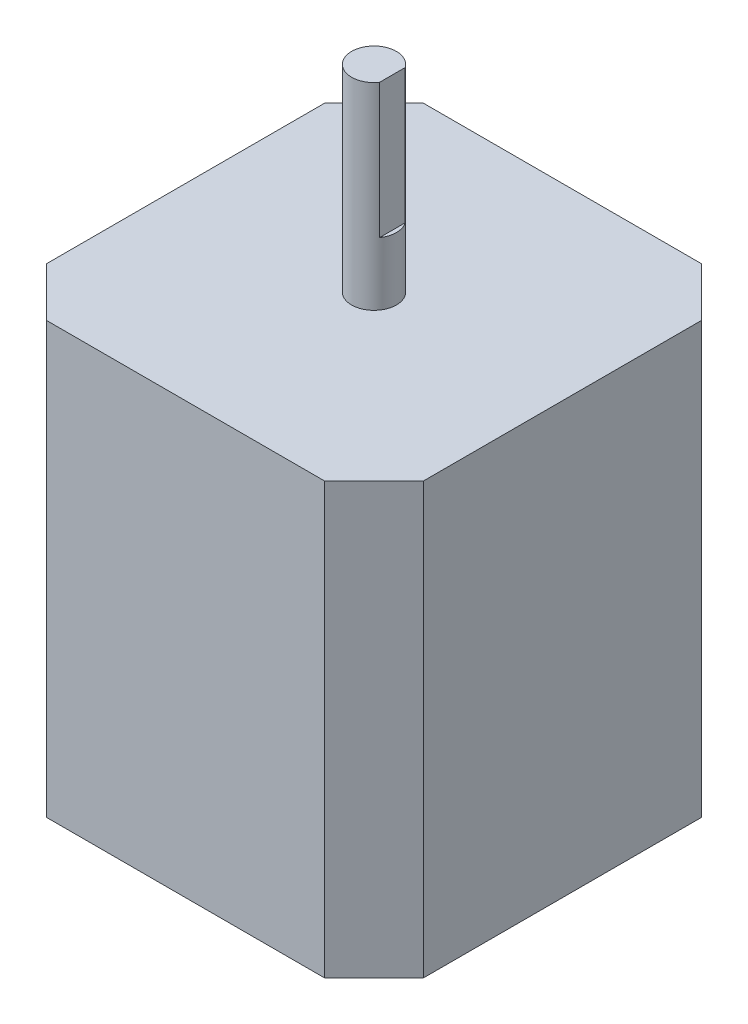
ISO-10303-21;
HEADER;
FILE_DESCRIPTION(('STEP AP214'),'2;1');
FILE_NAME('part.step','',(''),(''),'','','');
FILE_SCHEMA(('AUTOMOTIVE_DESIGN { 1 0 10303 214 1 1 1 1 }'));
ENDSEC;
DATA;
#1=APPLICATION_CONTEXT('core data for automotive mechanical design processes');
#2=APPLICATION_PROTOCOL_DEFINITION('international standard','automotive_design',2000,#1);
#3=PRODUCT_CONTEXT('',#1,'mechanical');
#4=PRODUCT('Part','Part','',(#3));
#5=PRODUCT_RELATED_PRODUCT_CATEGORY('part','',(#4));
#6=PRODUCT_DEFINITION_FORMATION('','',#4);
#7=PRODUCT_DEFINITION_CONTEXT('part definition',#1,'design');
#8=PRODUCT_DEFINITION('design','',#6,#7);
#9=PRODUCT_DEFINITION_SHAPE('','',#8);
#10=(LENGTH_UNIT() NAMED_UNIT(*) SI_UNIT(.MILLI.,.METRE.));
#11=(NAMED_UNIT(*) PLANE_ANGLE_UNIT() SI_UNIT($,.RADIAN.));
#12=(NAMED_UNIT(*) SI_UNIT($,.STERADIAN.) SOLID_ANGLE_UNIT());
#13=UNCERTAINTY_MEASURE_WITH_UNIT(LENGTH_MEASURE(1.E-05),#10,'distance_accuracy_value','');
#14=(GEOMETRIC_REPRESENTATION_CONTEXT(3) GLOBAL_UNCERTAINTY_ASSIGNED_CONTEXT((#13)) GLOBAL_UNIT_ASSIGNED_CONTEXT((#10,
#11,#12)) REPRESENTATION_CONTEXT('',''));
#15=CARTESIAN_POINT('',(0.,0.,0.));
#16=DIRECTION('',(0.,0.,1.));
#17=DIRECTION('',(1.,0.,0.));
#18=AXIS2_PLACEMENT_3D('',#15,#16,#17);
#19=CARTESIAN_POINT('',(21.,70.,-21.));
#20=DIRECTION('',(0.,-1.,0.));
#21=DIRECTION('',(0.,0.,-1.));
#22=AXIS2_PLACEMENT_3D('',#19,#20,#21);
#23=CYLINDRICAL_SURFACE('',#22,2.5);
#24=CARTESIAN_POINT('',(21.,48.,-21.));
#25=DIRECTION('',(0.,-1.,0.));
#26=DIRECTION('',(0.,0.,-1.));
#27=AXIS2_PLACEMENT_3D('',#24,#25,#26);
#28=CIRCLE('',#27,2.5);
#29=CARTESIAN_POINT('',(21.,48.,-23.5));
#30=VERTEX_POINT('',#29);
#31=EDGE_CURVE('E11',#30,#30,#28,.F.);
#32=ORIENTED_EDGE('',*,*,#31,.T.);
#33=EDGE_LOOP('',(#32));
#34=FACE_BOUND('',#33,.T.);
#35=DIRECTION('',(0.,1.,0.));
#36=VECTOR('',#35,1.);
#37=CARTESIAN_POINT('',(23.05,55.,-19.5690911978746));
#38=LINE('',#37,#36);
#39=CARTESIAN_POINT('',(23.05,55.,-19.5690911978746));
#40=VERTEX_POINT('',#39);
#41=CARTESIAN_POINT('',(23.05,70.,-19.5690911978746));
#42=VERTEX_POINT('',#41);
#43=EDGE_CURVE('E110',#40,#42,#38,.T.);
#44=ORIENTED_EDGE('',*,*,#43,.T.);
#45=CARTESIAN_POINT('',(21.,70.,-21.));
#46=DIRECTION('',(0.,1.,0.));
#47=DIRECTION('',(0.,0.,1.));
#48=AXIS2_PLACEMENT_3D('',#45,#46,#47);
#49=CIRCLE('',#48,2.5);
#50=CARTESIAN_POINT('',(23.05,70.,-22.4309088021254));
#51=VERTEX_POINT('',#50);
#52=EDGE_CURVE('E128',#51,#42,#49,.T.);
#53=ORIENTED_EDGE('',*,*,#52,.F.);
#54=DIRECTION('',(0.,1.,0.));
#55=VECTOR('',#54,1.);
#56=CARTESIAN_POINT('',(23.05,55.,-22.4309088021254));
#57=LINE('',#56,#55);
#58=CARTESIAN_POINT('',(23.05,55.,-22.4309088021254));
#59=VERTEX_POINT('',#58);
#60=EDGE_CURVE('E48',#59,#51,#57,.T.);
#61=ORIENTED_EDGE('',*,*,#60,.F.);
#62=CARTESIAN_POINT('',(21.,55.,-21.));
#63=DIRECTION('',(0.,1.,0.));
#64=DIRECTION('',(0.,0.,1.));
#65=AXIS2_PLACEMENT_3D('',#62,#63,#64);
#66=CIRCLE('',#65,2.5);
#67=EDGE_CURVE('E120',#40,#59,#66,.T.);
#68=ORIENTED_EDGE('',*,*,#67,.F.);
#69=EDGE_LOOP('',(#44,#53,#61,#68));
#70=FACE_BOUND('',#69,.T.);
#71=ADVANCED_FACE('F33',(#34,#70),#23,.T.);
#72=CARTESIAN_POINT('',(21.,70.,-21.));
#73=DIRECTION('',(0.,1.,0.));
#74=DIRECTION('',(0.,0.,1.));
#75=AXIS2_PLACEMENT_3D('',#72,#73,#74);
#76=PLANE('',#75);
#77=ORIENTED_EDGE('',*,*,#52,.T.);
#78=DIRECTION('',(0.,0.,-1.));
#79=VECTOR('',#78,1.);
#80=CARTESIAN_POINT('',(23.05,70.,0.));
#81=LINE('',#80,#79);
#82=EDGE_CURVE('E115',#42,#51,#81,.T.);
#83=ORIENTED_EDGE('',*,*,#82,.T.);
#84=EDGE_LOOP('',(#77,#83));
#85=FACE_BOUND('',#84,.T.);
#86=ADVANCED_FACE('F228',(#85),#76,.T.);
#87=CARTESIAN_POINT('',(0.,48.,0.));
#88=DIRECTION('',(1.,0.,0.));
#89=DIRECTION('',(0.,0.,-1.));
#90=AXIS2_PLACEMENT_3D('',#87,#88,#89);
#91=PLANE('',#90);
#92=DIRECTION('',(0.,0.,1.));
#93=VECTOR('',#92,1.);
#94=CARTESIAN_POINT('',(0.,0.,0.));
#95=LINE('',#94,#93);
#96=CARTESIAN_POINT('',(0.,0.,-36.5));
#97=VERTEX_POINT('',#96);
#98=CARTESIAN_POINT('',(0.,0.,-5.50000000000002));
#99=VERTEX_POINT('',#98);
#100=EDGE_CURVE('E131',#97,#99,#95,.T.);
#101=ORIENTED_EDGE('',*,*,#100,.T.);
#102=DIRECTION('',(0.,1.,0.));
#103=VECTOR('',#102,1.);
#104=CARTESIAN_POINT('',(0.,48.,-5.50000000000002));
#105=LINE('',#104,#103);
#106=CARTESIAN_POINT('',(0.,48.,-5.50000000000002));
#107=VERTEX_POINT('',#106);
#108=EDGE_CURVE('E169',#99,#107,#105,.T.);
#109=ORIENTED_EDGE('',*,*,#108,.T.);
#110=DIRECTION('',(0.,0.,1.));
#111=VECTOR('',#110,1.);
#112=CARTESIAN_POINT('',(0.,48.,0.));
#113=LINE('',#112,#111);
#114=CARTESIAN_POINT('',(0.,48.,-36.5));
#115=VERTEX_POINT('',#114);
#116=EDGE_CURVE('E132',#115,#107,#113,.T.);
#117=ORIENTED_EDGE('',*,*,#116,.F.);
#118=DIRECTION('',(0.,-1.,0.));
#119=VECTOR('',#118,1.);
#120=CARTESIAN_POINT('',(0.,48.,-36.5));
#121=LINE('',#120,#119);
#122=EDGE_CURVE('E166',#115,#97,#121,.T.);
#123=ORIENTED_EDGE('',*,*,#122,.T.);
#124=EDGE_LOOP('',(#101,#109,#117,#123));
#125=FACE_BOUND('',#124,.T.);
#126=ADVANCED_FACE('F210',(#125),#91,.F.);
#127=CARTESIAN_POINT('',(0.,48.,0.));
#128=DIRECTION('',(0.,0.,-1.));
#129=DIRECTION('',(-1.,0.,0.));
#130=AXIS2_PLACEMENT_3D('',#127,#128,#129);
#131=PLANE('',#130);
#132=DIRECTION('',(1.,0.,0.));
#133=VECTOR('',#132,1.);
#134=CARTESIAN_POINT('',(0.,48.,0.));
#135=LINE('',#134,#133);
#136=CARTESIAN_POINT('',(5.50000000000001,48.,0.));
#137=VERTEX_POINT('',#136);
#138=CARTESIAN_POINT('',(36.5,48.,0.));
#139=VERTEX_POINT('',#138);
#140=EDGE_CURVE('E135',#137,#139,#135,.T.);
#141=ORIENTED_EDGE('',*,*,#140,.F.);
#142=DIRECTION('',(0.,-1.,0.));
#143=VECTOR('',#142,1.);
#144=CARTESIAN_POINT('',(5.50000000000001,48.,0.));
#145=LINE('',#144,#143);
#146=CARTESIAN_POINT('',(5.50000000000001,0.,0.));
#147=VERTEX_POINT('',#146);
#148=EDGE_CURVE('E155',#137,#147,#145,.T.);
#149=ORIENTED_EDGE('',*,*,#148,.T.);
#150=DIRECTION('',(1.,0.,0.));
#151=VECTOR('',#150,1.);
#152=CARTESIAN_POINT('',(0.,0.,0.));
#153=LINE('',#152,#151);
#154=CARTESIAN_POINT('',(36.5,0.,0.));
#155=VERTEX_POINT('',#154);
#156=EDGE_CURVE('E147',#147,#155,#153,.T.);
#157=ORIENTED_EDGE('',*,*,#156,.T.);
#158=DIRECTION('',(0.,1.,0.));
#159=VECTOR('',#158,1.);
#160=CARTESIAN_POINT('',(36.5,48.,0.));
#161=LINE('',#160,#159);
#162=EDGE_CURVE('E144',#155,#139,#161,.T.);
#163=ORIENTED_EDGE('',*,*,#162,.T.);
#164=EDGE_LOOP('',(#141,#149,#157,#163));
#165=FACE_BOUND('',#164,.T.);
#166=ADVANCED_FACE('F218',(#165),#131,.F.);
#167=CARTESIAN_POINT('',(42.,48.,0.));
#168=DIRECTION('',(-1.,0.,0.));
#169=DIRECTION('',(0.,0.,1.));
#170=AXIS2_PLACEMENT_3D('',#167,#168,#169);
#171=PLANE('',#170);
#172=DIRECTION('',(0.,0.,-1.));
#173=VECTOR('',#172,1.);
#174=CARTESIAN_POINT('',(42.,0.,0.));
#175=LINE('',#174,#173);
#176=CARTESIAN_POINT('',(42.,0.,-5.5));
#177=VERTEX_POINT('',#176);
#178=CARTESIAN_POINT('',(42.,0.,-36.5));
#179=VERTEX_POINT('',#178);
#180=EDGE_CURVE('E150',#177,#179,#175,.T.);
#181=ORIENTED_EDGE('',*,*,#180,.T.);
#182=DIRECTION('',(0.,1.,0.));
#183=VECTOR('',#182,1.);
#184=CARTESIAN_POINT('',(42.,48.,-36.5));
#185=LINE('',#184,#183);
#186=CARTESIAN_POINT('',(42.,48.,-36.5));
#187=VERTEX_POINT('',#186);
#188=EDGE_CURVE('E41',#179,#187,#185,.T.);
#189=ORIENTED_EDGE('',*,*,#188,.T.);
#190=DIRECTION('',(0.,0.,-1.));
#191=VECTOR('',#190,1.);
#192=CARTESIAN_POINT('',(42.,48.,0.));
#193=LINE('',#192,#191);
#194=CARTESIAN_POINT('',(42.,48.,-5.5));
#195=VERTEX_POINT('',#194);
#196=EDGE_CURVE('E139',#195,#187,#193,.T.);
#197=ORIENTED_EDGE('',*,*,#196,.F.);
#198=DIRECTION('',(0.,-1.,0.));
#199=VECTOR('',#198,1.);
#200=CARTESIAN_POINT('',(42.,48.,-5.50000000000001));
#201=LINE('',#200,#199);
#202=EDGE_CURVE('E183',#195,#177,#201,.T.);
#203=ORIENTED_EDGE('',*,*,#202,.T.);
#204=EDGE_LOOP('',(#181,#189,#197,#203));
#205=FACE_BOUND('',#204,.T.);
#206=ADVANCED_FACE('F188',(#205),#171,.F.);
#207=CARTESIAN_POINT('',(0.,48.,-42.));
#208=DIRECTION('',(0.,0.,1.));
#209=DIRECTION('',(1.,0.,0.));
#210=AXIS2_PLACEMENT_3D('',#207,#208,#209);
#211=PLANE('',#210);
#212=DIRECTION('',(-1.,0.,0.));
#213=VECTOR('',#212,1.);
#214=CARTESIAN_POINT('',(0.,0.,-42.));
#215=LINE('',#214,#213);
#216=CARTESIAN_POINT('',(36.5,0.,-42.));
#217=VERTEX_POINT('',#216);
#218=CARTESIAN_POINT('',(5.50000000000001,0.,-42.));
#219=VERTEX_POINT('',#218);
#220=EDGE_CURVE('E136',#217,#219,#215,.T.);
#221=ORIENTED_EDGE('',*,*,#220,.T.);
#222=DIRECTION('',(0.,1.,0.));
#223=VECTOR('',#222,1.);
#224=CARTESIAN_POINT('',(5.50000000000001,48.,-42.));
#225=LINE('',#224,#223);
#226=CARTESIAN_POINT('',(5.50000000000001,48.,-42.));
#227=VERTEX_POINT('',#226);
#228=EDGE_CURVE('E56',#219,#227,#225,.T.);
#229=ORIENTED_EDGE('',*,*,#228,.T.);
#230=DIRECTION('',(-1.,0.,0.));
#231=VECTOR('',#230,1.);
#232=CARTESIAN_POINT('',(0.,48.,-42.));
#233=LINE('',#232,#231);
#234=CARTESIAN_POINT('',(36.5,48.,-42.));
#235=VERTEX_POINT('',#234);
#236=EDGE_CURVE('E142',#235,#227,#233,.T.);
#237=ORIENTED_EDGE('',*,*,#236,.F.);
#238=DIRECTION('',(0.,-1.,0.));
#239=VECTOR('',#238,1.);
#240=CARTESIAN_POINT('',(36.5,48.,-42.));
#241=LINE('',#240,#239);
#242=EDGE_CURVE('E179',#235,#217,#241,.T.);
#243=ORIENTED_EDGE('',*,*,#242,.T.);
#244=EDGE_LOOP('',(#221,#229,#237,#243));
#245=FACE_BOUND('',#244,.T.);
#246=ADVANCED_FACE('F199',(#245),#211,.F.);
#247=CARTESIAN_POINT('',(0.,48.,0.));
#248=DIRECTION('',(0.,-1.,0.));
#249=DIRECTION('',(0.,0.,-1.));
#250=AXIS2_PLACEMENT_3D('',#247,#248,#249);
#251=PLANE('',#250);
#252=ORIENTED_EDGE('',*,*,#31,.F.);
#253=EDGE_LOOP('',(#252));
#254=FACE_BOUND('',#253,.T.);
#255=ORIENTED_EDGE('',*,*,#116,.T.);
#256=DIRECTION('',(-0.707106781186547,0.,-0.707106781186548));
#257=VECTOR('',#256,1.);
#258=CARTESIAN_POINT('',(5.50000000000001,48.,0.));
#259=LINE('',#258,#257);
#260=EDGE_CURVE('E177',#107,#137,#259,.F.);
#261=ORIENTED_EDGE('',*,*,#260,.T.);
#262=ORIENTED_EDGE('',*,*,#140,.T.);
#263=DIRECTION('',(-0.707106781186548,0.,0.707106781186547));
#264=VECTOR('',#263,1.);
#265=CARTESIAN_POINT('',(42.,48.,-5.50000000000001));
#266=LINE('',#265,#264);
#267=EDGE_CURVE('E171',#139,#195,#266,.F.);
#268=ORIENTED_EDGE('',*,*,#267,.T.);
#269=ORIENTED_EDGE('',*,*,#196,.T.);
#270=DIRECTION('',(0.707106781186546,0.,0.707106781186549));
#271=VECTOR('',#270,1.);
#272=CARTESIAN_POINT('',(36.5,48.,-42.));
#273=LINE('',#272,#271);
#274=EDGE_CURVE('E173',#187,#235,#273,.F.);
#275=ORIENTED_EDGE('',*,*,#274,.T.);
#276=ORIENTED_EDGE('',*,*,#236,.T.);
#277=DIRECTION('',(0.707106781186549,0.,-0.707106781186546));
#278=VECTOR('',#277,1.);
#279=CARTESIAN_POINT('',(0.,48.,-36.5));
#280=LINE('',#279,#278);
#281=EDGE_CURVE('E175',#227,#115,#280,.F.);
#282=ORIENTED_EDGE('',*,*,#281,.T.);
#283=EDGE_LOOP('',(#255,#261,#262,#268,#269,#275,#276,#282));
#284=FACE_BOUND('',#283,.T.);
#285=ADVANCED_FACE('F194',(#254,#284),#251,.F.);
#286=CARTESIAN_POINT('',(0.,0.,0.));
#287=DIRECTION('',(0.,-1.,0.));
#288=DIRECTION('',(0.,0.,-1.));
#289=AXIS2_PLACEMENT_3D('',#286,#287,#288);
#290=PLANE('',#289);
#291=ORIENTED_EDGE('',*,*,#156,.F.);
#292=DIRECTION('',(0.707106781186547,0.,0.707106781186548));
#293=VECTOR('',#292,1.);
#294=CARTESIAN_POINT('',(2.75000000000001,0.,-2.75));
#295=LINE('',#294,#293);
#296=EDGE_CURVE('E164',#147,#99,#295,.F.);
#297=ORIENTED_EDGE('',*,*,#296,.T.);
#298=ORIENTED_EDGE('',*,*,#100,.F.);
#299=DIRECTION('',(-0.707106781186549,0.,0.707106781186546));
#300=VECTOR('',#299,1.);
#301=CARTESIAN_POINT('',(-18.25,0.,-18.2500000000001));
#302=LINE('',#301,#300);
#303=EDGE_CURVE('E162',#97,#219,#302,.F.);
#304=ORIENTED_EDGE('',*,*,#303,.T.);
#305=ORIENTED_EDGE('',*,*,#220,.F.);
#306=DIRECTION('',(-0.707106781186546,0.,-0.707106781186549));
#307=VECTOR('',#306,1.);
#308=CARTESIAN_POINT('',(39.2500000000001,0.,-39.2499999999999));
#309=LINE('',#308,#307);
#310=EDGE_CURVE('E160',#217,#179,#309,.F.);
#311=ORIENTED_EDGE('',*,*,#310,.T.);
#312=ORIENTED_EDGE('',*,*,#180,.F.);
#313=DIRECTION('',(0.707106781186548,0.,-0.707106781186547));
#314=VECTOR('',#313,1.);
#315=CARTESIAN_POINT('',(18.25,0.,18.25));
#316=LINE('',#315,#314);
#317=EDGE_CURVE('E158',#177,#155,#316,.F.);
#318=ORIENTED_EDGE('',*,*,#317,.T.);
#319=EDGE_LOOP('',(#291,#297,#298,#304,#305,#311,#312,#318));
#320=FACE_BOUND('',#319,.T.);
#321=ADVANCED_FACE('F202',(#320),#290,.T.);
#322=CARTESIAN_POINT('',(5.50000000000001,48.,0.));
#323=DIRECTION('',(0.707106781186548,0.,-0.707106781186547));
#324=DIRECTION('',(0.,-1.,0.));
#325=AXIS2_PLACEMENT_3D('',#322,#323,#324);
#326=PLANE('',#325);
#327=ORIENTED_EDGE('',*,*,#260,.F.);
#328=ORIENTED_EDGE('',*,*,#108,.F.);
#329=ORIENTED_EDGE('',*,*,#296,.F.);
#330=ORIENTED_EDGE('',*,*,#148,.F.);
#331=EDGE_LOOP('',(#327,#328,#329,#330));
#332=FACE_BOUND('',#331,.T.);
#333=ADVANCED_FACE('F216',(#332),#326,.F.);
#334=CARTESIAN_POINT('',(0.,48.,-36.5));
#335=DIRECTION('',(0.707106781186546,0.,0.707106781186549));
#336=DIRECTION('',(0.,-1.,0.));
#337=AXIS2_PLACEMENT_3D('',#334,#335,#336);
#338=PLANE('',#337);
#339=ORIENTED_EDGE('',*,*,#281,.F.);
#340=ORIENTED_EDGE('',*,*,#228,.F.);
#341=ORIENTED_EDGE('',*,*,#303,.F.);
#342=ORIENTED_EDGE('',*,*,#122,.F.);
#343=EDGE_LOOP('',(#339,#340,#341,#342));
#344=FACE_BOUND('',#343,.T.);
#345=ADVANCED_FACE('F207',(#344),#338,.F.);
#346=CARTESIAN_POINT('',(36.5,48.,-42.));
#347=DIRECTION('',(-0.707106781186549,0.,0.707106781186546));
#348=DIRECTION('',(0.,-1.,0.));
#349=AXIS2_PLACEMENT_3D('',#346,#347,#348);
#350=PLANE('',#349);
#351=ORIENTED_EDGE('',*,*,#274,.F.);
#352=ORIENTED_EDGE('',*,*,#188,.F.);
#353=ORIENTED_EDGE('',*,*,#310,.F.);
#354=ORIENTED_EDGE('',*,*,#242,.F.);
#355=EDGE_LOOP('',(#351,#352,#353,#354));
#356=FACE_BOUND('',#355,.T.);
#357=ADVANCED_FACE('F197',(#356),#350,.F.);
#358=CARTESIAN_POINT('',(42.,48.,-5.50000000000001));
#359=DIRECTION('',(-0.707106781186547,0.,-0.707106781186548));
#360=DIRECTION('',(0.,-1.,0.));
#361=AXIS2_PLACEMENT_3D('',#358,#359,#360);
#362=PLANE('',#361);
#363=ORIENTED_EDGE('',*,*,#267,.F.);
#364=ORIENTED_EDGE('',*,*,#162,.F.);
#365=ORIENTED_EDGE('',*,*,#317,.F.);
#366=ORIENTED_EDGE('',*,*,#202,.F.);
#367=EDGE_LOOP('',(#363,#364,#365,#366));
#368=FACE_BOUND('',#367,.T.);
#369=ADVANCED_FACE('F35',(#368),#362,.F.);
#370=CARTESIAN_POINT('',(23.05,55.,0.));
#371=DIRECTION('',(1.,0.,0.));
#372=DIRECTION('',(0.,0.,-1.));
#373=AXIS2_PLACEMENT_3D('',#370,#371,#372);
#374=PLANE('',#373);
#375=ORIENTED_EDGE('',*,*,#82,.F.);
#376=ORIENTED_EDGE('',*,*,#43,.F.);
#377=DIRECTION('',(0.,0.,-1.));
#378=VECTOR('',#377,1.);
#379=CARTESIAN_POINT('',(23.05,55.,0.));
#380=LINE('',#379,#378);
#381=EDGE_CURVE('E113',#40,#59,#380,.T.);
#382=ORIENTED_EDGE('',*,*,#381,.T.);
#383=ORIENTED_EDGE('',*,*,#60,.T.);
#384=EDGE_LOOP('',(#375,#376,#382,#383));
#385=FACE_BOUND('',#384,.T.);
#386=ADVANCED_FACE('F112',(#385),#374,.T.);
#387=CARTESIAN_POINT('',(0.,55.,0.));
#388=DIRECTION('',(0.,1.,0.));
#389=DIRECTION('',(0.,0.,1.));
#390=AXIS2_PLACEMENT_3D('',#387,#388,#389);
#391=PLANE('',#390);
#392=ORIENTED_EDGE('',*,*,#381,.F.);
#393=ORIENTED_EDGE('',*,*,#67,.T.);
#394=EDGE_LOOP('',(#392,#393));
#395=FACE_BOUND('',#394,.T.);
#396=ADVANCED_FACE('F123',(#395),#391,.T.);
#397=CLOSED_SHELL('',(#71,#86,#126,#166,#206,#246,#285,#321,#333,#345,#357,#369,#386,#396));
#398=MANIFOLD_SOLID_BREP('B2',#397);
#399=ADVANCED_BREP_SHAPE_REPRESENTATION('',(#18,#398),#14);
#400=SHAPE_DEFINITION_REPRESENTATION(#9,#399);
ENDSEC;
END-ISO-10303-21;
